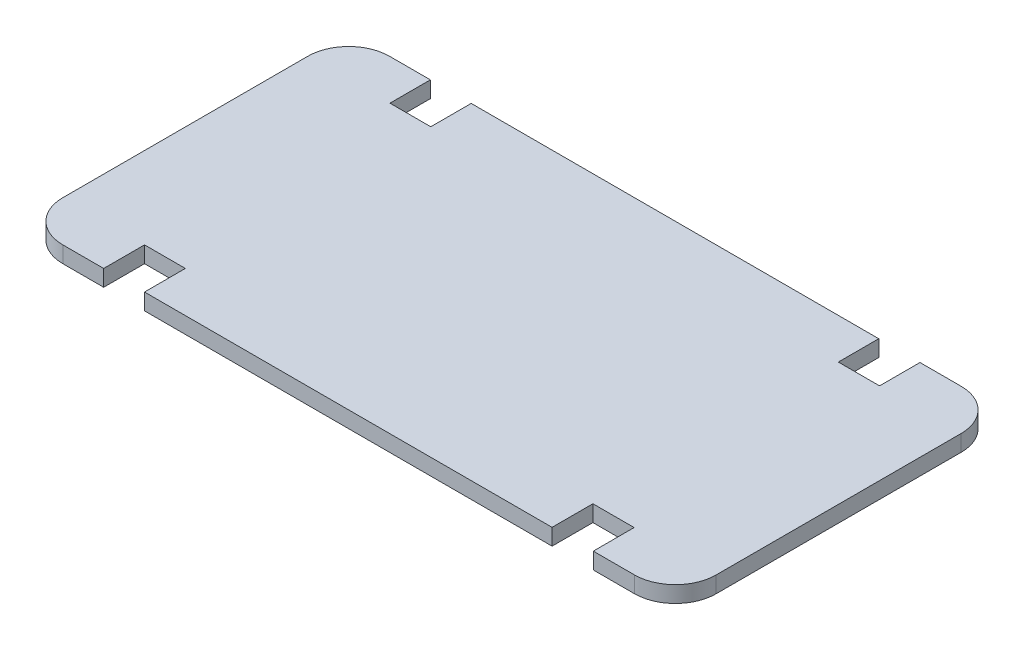
ISO-10303-21;
HEADER;
FILE_DESCRIPTION(('STEP AP214'),'2;1');
FILE_NAME('part.step','',(''),(''),'','','');
FILE_SCHEMA(('AUTOMOTIVE_DESIGN { 1 0 10303 214 1 1 1 1 }'));
ENDSEC;
DATA;
#1=APPLICATION_CONTEXT('core data for automotive mechanical design processes');
#2=APPLICATION_PROTOCOL_DEFINITION('international standard','automotive_design',2000,#1);
#3=PRODUCT_CONTEXT('',#1,'mechanical');
#4=PRODUCT('Part','Part','',(#3));
#5=PRODUCT_RELATED_PRODUCT_CATEGORY('part','',(#4));
#6=PRODUCT_DEFINITION_FORMATION('','',#4);
#7=PRODUCT_DEFINITION_CONTEXT('part definition',#1,'design');
#8=PRODUCT_DEFINITION('design','',#6,#7);
#9=PRODUCT_DEFINITION_SHAPE('','',#8);
#10=(LENGTH_UNIT() NAMED_UNIT(*) SI_UNIT(.MILLI.,.METRE.));
#11=(NAMED_UNIT(*) PLANE_ANGLE_UNIT() SI_UNIT($,.RADIAN.));
#12=(NAMED_UNIT(*) SI_UNIT($,.STERADIAN.) SOLID_ANGLE_UNIT());
#13=UNCERTAINTY_MEASURE_WITH_UNIT(LENGTH_MEASURE(1.E-05),#10,'distance_accuracy_value','');
#14=(GEOMETRIC_REPRESENTATION_CONTEXT(3) GLOBAL_UNCERTAINTY_ASSIGNED_CONTEXT((#13)) GLOBAL_UNIT_ASSIGNED_CONTEXT((#10,
#11,#12)) REPRESENTATION_CONTEXT('',''));
#15=CARTESIAN_POINT('',(0.,0.,0.));
#16=DIRECTION('',(0.,0.,1.));
#17=DIRECTION('',(1.,0.,0.));
#18=AXIS2_PLACEMENT_3D('',#15,#16,#17);
#19=CARTESIAN_POINT('',(-88.8999999999999,5.08,50.8));
#20=DIRECTION('',(0.,0.,-1.));
#21=DIRECTION('',(-1.,0.,0.));
#22=AXIS2_PLACEMENT_3D('',#19,#20,#21);
#23=PLANE('',#22);
#24=DIRECTION('',(1.,0.,0.));
#25=VECTOR('',#24,1.);
#26=CARTESIAN_POINT('',(-88.8999999999999,0.,50.8));
#27=LINE('',#26,#25);
#28=CARTESIAN_POINT('',(-63.4886516228168,0.,50.8));
#29=VERTEX_POINT('',#28);
#30=CARTESIAN_POINT('',(63.2623425436965,0.,50.8));
#31=VERTEX_POINT('',#30);
#32=EDGE_CURVE('E272',#29,#31,#27,.T.);
#33=ORIENTED_EDGE('',*,*,#32,.T.);
#34=DIRECTION('',(0.,1.,0.));
#35=VECTOR('',#34,1.);
#36=CARTESIAN_POINT('',(63.2623425436965,0.,50.8));
#37=LINE('',#36,#35);
#38=CARTESIAN_POINT('',(63.2623425436965,5.08,50.8));
#39=VERTEX_POINT('',#38);
#40=EDGE_CURVE('E331',#31,#39,#37,.T.);
#41=ORIENTED_EDGE('',*,*,#40,.T.);
#42=DIRECTION('',(1.,0.,0.));
#43=VECTOR('',#42,1.);
#44=CARTESIAN_POINT('',(-88.8999999999999,5.08,50.8));
#45=LINE('',#44,#43);
#46=CARTESIAN_POINT('',(-63.4886516228168,5.08,50.8));
#47=VERTEX_POINT('',#46);
#48=EDGE_CURVE('E294',#47,#39,#45,.T.);
#49=ORIENTED_EDGE('',*,*,#48,.F.);
#50=DIRECTION('',(0.,1.,0.));
#51=VECTOR('',#50,1.);
#52=CARTESIAN_POINT('',(-63.4886516228168,0.,50.8));
#53=LINE('',#52,#51);
#54=EDGE_CURVE('E298',#29,#47,#53,.T.);
#55=ORIENTED_EDGE('',*,*,#54,.F.);
#56=EDGE_LOOP('',(#33,#41,#49,#55));
#57=FACE_BOUND('',#56,.T.);
#58=ADVANCED_FACE('F34',(#57),#23,.F.);
#59=CARTESIAN_POINT('',(-88.8999999999999,0.,50.8));
#60=VERTEX_POINT('',#59);
#61=CARTESIAN_POINT('',(-76.1886516228168,0.,50.8));
#62=VERTEX_POINT('',#61);
#63=EDGE_CURVE('E269',#60,#62,#27,.T.);
#64=ORIENTED_EDGE('',*,*,#63,.T.);
#65=DIRECTION('',(0.,1.,0.));
#66=VECTOR('',#65,1.);
#67=CARTESIAN_POINT('',(-76.1886516228168,0.,50.8));
#68=LINE('',#67,#66);
#69=CARTESIAN_POINT('',(-76.1886516228168,5.08,50.8));
#70=VERTEX_POINT('',#69);
#71=EDGE_CURVE('E278',#62,#70,#68,.T.);
#72=ORIENTED_EDGE('',*,*,#71,.T.);
#73=CARTESIAN_POINT('',(-88.8999999999999,5.08,50.8));
#74=VERTEX_POINT('',#73);
#75=EDGE_CURVE('E291',#74,#70,#45,.T.);
#76=ORIENTED_EDGE('',*,*,#75,.F.);
#77=DIRECTION('',(0.,-1.,0.));
#78=VECTOR('',#77,1.);
#79=CARTESIAN_POINT('',(-88.8999999999999,5.08,50.8));
#80=LINE('',#79,#78);
#81=EDGE_CURVE('E11',#74,#60,#80,.T.);
#82=ORIENTED_EDGE('',*,*,#81,.T.);
#83=EDGE_LOOP('',(#64,#72,#76,#82));
#84=FACE_BOUND('',#83,.T.);
#85=ADVANCED_FACE('F413',(#84),#23,.F.);
#86=CARTESIAN_POINT('',(-88.8999999999999,5.08,-50.8));
#87=DIRECTION('',(0.,0.,1.));
#88=DIRECTION('',(1.,0.,0.));
#89=AXIS2_PLACEMENT_3D('',#86,#87,#88);
#90=PLANE('',#89);
#91=DIRECTION('',(-1.,0.,0.));
#92=VECTOR('',#91,1.);
#93=CARTESIAN_POINT('',(-88.8999999999999,5.08,-50.8));
#94=LINE('',#93,#92);
#95=CARTESIAN_POINT('',(-76.1886516228168,5.08,-50.8));
#96=VERTEX_POINT('',#95);
#97=CARTESIAN_POINT('',(-88.8999999999999,5.08,-50.8));
#98=VERTEX_POINT('',#97);
#99=EDGE_CURVE('E285',#96,#98,#94,.T.);
#100=ORIENTED_EDGE('',*,*,#99,.F.);
#101=DIRECTION('',(0.,1.,0.));
#102=VECTOR('',#101,1.);
#103=CARTESIAN_POINT('',(-76.1886516228168,0.,-50.8));
#104=LINE('',#103,#102);
#105=CARTESIAN_POINT('',(-76.1886516228168,0.,-50.8));
#106=VERTEX_POINT('',#105);
#107=EDGE_CURVE('E316',#106,#96,#104,.T.);
#108=ORIENTED_EDGE('',*,*,#107,.F.);
#109=DIRECTION('',(-1.,0.,0.));
#110=VECTOR('',#109,1.);
#111=CARTESIAN_POINT('',(-88.8999999999999,0.,-50.8));
#112=LINE('',#111,#110);
#113=CARTESIAN_POINT('',(-88.8999999999999,0.,-50.8));
#114=VERTEX_POINT('',#113);
#115=EDGE_CURVE('E222',#106,#114,#112,.T.);
#116=ORIENTED_EDGE('',*,*,#115,.T.);
#117=DIRECTION('',(0.,-1.,0.));
#118=VECTOR('',#117,1.);
#119=CARTESIAN_POINT('',(-88.8999999999999,5.08,-50.8));
#120=LINE('',#119,#118);
#121=EDGE_CURVE('E241',#98,#114,#120,.T.);
#122=ORIENTED_EDGE('',*,*,#121,.F.);
#123=EDGE_LOOP('',(#100,#108,#116,#122));
#124=FACE_BOUND('',#123,.T.);
#125=ADVANCED_FACE('F418',(#124),#90,.F.);
#126=CARTESIAN_POINT('',(88.8999999999999,0.,-50.8));
#127=VERTEX_POINT('',#126);
#128=CARTESIAN_POINT('',(76.0844929826214,0.,-50.8));
#129=VERTEX_POINT('',#128);
#130=EDGE_CURVE('E221',#127,#129,#112,.T.);
#131=ORIENTED_EDGE('',*,*,#130,.T.);
#132=DIRECTION('',(0.,1.,0.));
#133=VECTOR('',#132,1.);
#134=CARTESIAN_POINT('',(76.0844929826214,0.,-50.8));
#135=LINE('',#134,#133);
#136=CARTESIAN_POINT('',(76.0844929826214,5.08,-50.8));
#137=VERTEX_POINT('',#136);
#138=EDGE_CURVE('E344',#129,#137,#135,.T.);
#139=ORIENTED_EDGE('',*,*,#138,.T.);
#140=CARTESIAN_POINT('',(88.8999999999999,5.08,-50.8));
#141=VERTEX_POINT('',#140);
#142=EDGE_CURVE('E282',#141,#137,#94,.T.);
#143=ORIENTED_EDGE('',*,*,#142,.F.);
#144=DIRECTION('',(0.,-1.,0.));
#145=VECTOR('',#144,1.);
#146=CARTESIAN_POINT('',(88.8999999999999,5.08,-50.8));
#147=LINE('',#146,#145);
#148=EDGE_CURVE('E244',#141,#127,#147,.T.);
#149=ORIENTED_EDGE('',*,*,#148,.T.);
#150=EDGE_LOOP('',(#131,#139,#143,#149));
#151=FACE_BOUND('',#150,.T.);
#152=ADVANCED_FACE('F391',(#151),#90,.F.);
#153=CARTESIAN_POINT('',(-88.9,5.08,38.1));
#154=DIRECTION('',(0.,-1.,0.));
#155=DIRECTION('',(0.,0.,-1.));
#156=AXIS2_PLACEMENT_3D('',#153,#154,#155);
#157=CYLINDRICAL_SURFACE('',#156,12.7);
#158=CARTESIAN_POINT('',(-88.9,0.,38.1));
#159=DIRECTION('',(0.,1.,0.));
#160=DIRECTION('',(0.,0.,-1.));
#161=AXIS2_PLACEMENT_3D('',#158,#159,#160);
#162=CIRCLE('',#161,12.7);
#163=CARTESIAN_POINT('',(-101.6,0.,38.0999999999999));
#164=VERTEX_POINT('',#163);
#165=EDGE_CURVE('E275',#164,#60,#162,.T.);
#166=ORIENTED_EDGE('',*,*,#165,.T.);
#167=ORIENTED_EDGE('',*,*,#81,.F.);
#168=CARTESIAN_POINT('',(-88.9,5.08,38.1));
#169=DIRECTION('',(0.,1.,0.));
#170=DIRECTION('',(0.,0.,-1.));
#171=AXIS2_PLACEMENT_3D('',#168,#169,#170);
#172=CIRCLE('',#171,12.7);
#173=CARTESIAN_POINT('',(-101.6,5.08,38.0999999999999));
#174=VERTEX_POINT('',#173);
#175=EDGE_CURVE('E233',#174,#74,#172,.T.);
#176=ORIENTED_EDGE('',*,*,#175,.F.);
#177=DIRECTION('',(0.,-1.,0.));
#178=VECTOR('',#177,1.);
#179=CARTESIAN_POINT('',(-101.6,5.08,38.0999999999999));
#180=LINE('',#179,#178);
#181=EDGE_CURVE('E234',#174,#164,#180,.T.);
#182=ORIENTED_EDGE('',*,*,#181,.T.);
#183=EDGE_LOOP('',(#166,#167,#176,#182));
#184=FACE_BOUND('',#183,.T.);
#185=ADVANCED_FACE('F36',(#184),#157,.T.);
#186=CARTESIAN_POINT('',(76.0844929826214,5.08,50.8));
#187=VERTEX_POINT('',#186);
#188=CARTESIAN_POINT('',(88.8999999999999,5.08,50.8));
#189=VERTEX_POINT('',#188);
#190=EDGE_CURVE('E295',#187,#189,#45,.T.);
#191=ORIENTED_EDGE('',*,*,#190,.F.);
#192=DIRECTION('',(0.,1.,0.));
#193=VECTOR('',#192,1.);
#194=CARTESIAN_POINT('',(76.0844929826214,0.,50.8));
#195=LINE('',#194,#193);
#196=CARTESIAN_POINT('',(76.0844929826214,0.,50.8));
#197=VERTEX_POINT('',#196);
#198=EDGE_CURVE('E324',#197,#187,#195,.T.);
#199=ORIENTED_EDGE('',*,*,#198,.F.);
#200=CARTESIAN_POINT('',(88.8999999999999,0.,50.8));
#201=VERTEX_POINT('',#200);
#202=EDGE_CURVE('E266',#197,#201,#27,.T.);
#203=ORIENTED_EDGE('',*,*,#202,.T.);
#204=DIRECTION('',(0.,-1.,0.));
#205=VECTOR('',#204,1.);
#206=CARTESIAN_POINT('',(88.8999999999999,5.08,50.8));
#207=LINE('',#206,#205);
#208=EDGE_CURVE('E42',#189,#201,#207,.T.);
#209=ORIENTED_EDGE('',*,*,#208,.F.);
#210=EDGE_LOOP('',(#191,#199,#203,#209));
#211=FACE_BOUND('',#210,.T.);
#212=ADVANCED_FACE('F410',(#211),#23,.F.);
#213=CARTESIAN_POINT('',(88.9,5.08,38.1));
#214=DIRECTION('',(0.,-1.,0.));
#215=DIRECTION('',(0.,0.,-1.));
#216=AXIS2_PLACEMENT_3D('',#213,#214,#215);
#217=CYLINDRICAL_SURFACE('',#216,12.7);
#218=CARTESIAN_POINT('',(88.9,0.,38.1));
#219=DIRECTION('',(0.,1.,0.));
#220=DIRECTION('',(0.,0.,1.));
#221=AXIS2_PLACEMENT_3D('',#218,#219,#220);
#222=CIRCLE('',#221,12.7);
#223=CARTESIAN_POINT('',(101.6,0.,38.0999999999999));
#224=VERTEX_POINT('',#223);
#225=EDGE_CURVE('E259',#201,#224,#222,.T.);
#226=ORIENTED_EDGE('',*,*,#225,.T.);
#227=DIRECTION('',(0.,-1.,0.));
#228=VECTOR('',#227,1.);
#229=CARTESIAN_POINT('',(101.6,5.08,38.0999999999999));
#230=LINE('',#229,#228);
#231=CARTESIAN_POINT('',(101.6,5.08,38.0999999999999));
#232=VERTEX_POINT('',#231);
#233=EDGE_CURVE('E250',#232,#224,#230,.T.);
#234=ORIENTED_EDGE('',*,*,#233,.F.);
#235=CARTESIAN_POINT('',(88.9,5.08,38.1));
#236=DIRECTION('',(0.,1.,0.));
#237=DIRECTION('',(0.,0.,1.));
#238=AXIS2_PLACEMENT_3D('',#235,#236,#237);
#239=CIRCLE('',#238,12.7);
#240=EDGE_CURVE('E260',#189,#232,#239,.T.);
#241=ORIENTED_EDGE('',*,*,#240,.F.);
#242=ORIENTED_EDGE('',*,*,#208,.T.);
#243=EDGE_LOOP('',(#226,#234,#241,#242));
#244=FACE_BOUND('',#243,.T.);
#245=ADVANCED_FACE('F257',(#244),#217,.T.);
#246=CARTESIAN_POINT('',(101.6,5.08,38.0999999999999));
#247=DIRECTION('',(-1.,0.,0.));
#248=DIRECTION('',(0.,0.,1.));
#249=AXIS2_PLACEMENT_3D('',#246,#247,#248);
#250=PLANE('',#249);
#251=DIRECTION('',(0.,0.,-1.));
#252=VECTOR('',#251,1.);
#253=CARTESIAN_POINT('',(101.6,0.,38.0999999999999));
#254=LINE('',#253,#252);
#255=CARTESIAN_POINT('',(101.6,0.,-38.0999999999999));
#256=VERTEX_POINT('',#255);
#257=EDGE_CURVE('E268',#224,#256,#254,.T.);
#258=ORIENTED_EDGE('',*,*,#257,.T.);
#259=DIRECTION('',(0.,-1.,0.));
#260=VECTOR('',#259,1.);
#261=CARTESIAN_POINT('',(101.6,5.08,-38.0999999999999));
#262=LINE('',#261,#260);
#263=CARTESIAN_POINT('',(101.6,5.08,-38.0999999999999));
#264=VERTEX_POINT('',#263);
#265=EDGE_CURVE('E247',#264,#256,#262,.T.);
#266=ORIENTED_EDGE('',*,*,#265,.F.);
#267=DIRECTION('',(0.,0.,-1.));
#268=VECTOR('',#267,1.);
#269=CARTESIAN_POINT('',(101.6,5.08,38.0999999999999));
#270=LINE('',#269,#268);
#271=EDGE_CURVE('E288',#232,#264,#270,.T.);
#272=ORIENTED_EDGE('',*,*,#271,.F.);
#273=ORIENTED_EDGE('',*,*,#233,.T.);
#274=EDGE_LOOP('',(#258,#266,#272,#273));
#275=FACE_BOUND('',#274,.T.);
#276=ADVANCED_FACE('F402',(#275),#250,.F.);
#277=CARTESIAN_POINT('',(88.9,5.08,-38.1));
#278=DIRECTION('',(0.,-1.,0.));
#279=DIRECTION('',(0.,0.,-1.));
#280=AXIS2_PLACEMENT_3D('',#277,#278,#279);
#281=CYLINDRICAL_SURFACE('',#280,12.7);
#282=CARTESIAN_POINT('',(88.9,0.,-38.1));
#283=DIRECTION('',(0.,1.,0.));
#284=DIRECTION('',(0.,0.,-1.));
#285=AXIS2_PLACEMENT_3D('',#282,#283,#284);
#286=CIRCLE('',#285,12.7);
#287=EDGE_CURVE('E226',#256,#127,#286,.T.);
#288=ORIENTED_EDGE('',*,*,#287,.T.);
#289=ORIENTED_EDGE('',*,*,#148,.F.);
#290=CARTESIAN_POINT('',(88.9,5.08,-38.1));
#291=DIRECTION('',(0.,1.,0.));
#292=DIRECTION('',(0.,0.,-1.));
#293=AXIS2_PLACEMENT_3D('',#290,#291,#292);
#294=CIRCLE('',#293,12.7);
#295=EDGE_CURVE('E286',#264,#141,#294,.T.);
#296=ORIENTED_EDGE('',*,*,#295,.F.);
#297=ORIENTED_EDGE('',*,*,#265,.T.);
#298=EDGE_LOOP('',(#288,#289,#296,#297));
#299=FACE_BOUND('',#298,.T.);
#300=ADVANCED_FACE('F400',(#299),#281,.T.);
#301=CARTESIAN_POINT('',(63.2623425436965,0.,-50.8));
#302=VERTEX_POINT('',#301);
#303=CARTESIAN_POINT('',(-63.4886516228168,0.,-50.8));
#304=VERTEX_POINT('',#303);
#305=EDGE_CURVE('E213',#302,#304,#112,.T.);
#306=ORIENTED_EDGE('',*,*,#305,.T.);
#307=DIRECTION('',(0.,1.,0.));
#308=VECTOR('',#307,1.);
#309=CARTESIAN_POINT('',(-63.4886516228168,0.,-50.8));
#310=LINE('',#309,#308);
#311=CARTESIAN_POINT('',(-63.4886516228168,5.08,-50.8));
#312=VERTEX_POINT('',#311);
#313=EDGE_CURVE('E353',#304,#312,#310,.T.);
#314=ORIENTED_EDGE('',*,*,#313,.T.);
#315=CARTESIAN_POINT('',(63.2623425436965,5.08,-50.8));
#316=VERTEX_POINT('',#315);
#317=EDGE_CURVE('E215',#316,#312,#94,.T.);
#318=ORIENTED_EDGE('',*,*,#317,.F.);
#319=DIRECTION('',(0.,1.,0.));
#320=VECTOR('',#319,1.);
#321=CARTESIAN_POINT('',(63.2623425436965,0.,-50.8));
#322=LINE('',#321,#320);
#323=EDGE_CURVE('E199',#302,#316,#322,.T.);
#324=ORIENTED_EDGE('',*,*,#323,.F.);
#325=EDGE_LOOP('',(#306,#314,#318,#324));
#326=FACE_BOUND('',#325,.T.);
#327=ADVANCED_FACE('F211',(#326),#90,.F.);
#328=CARTESIAN_POINT('',(-88.9,5.08,-38.1));
#329=DIRECTION('',(0.,-1.,0.));
#330=DIRECTION('',(0.,0.,-1.));
#331=AXIS2_PLACEMENT_3D('',#328,#329,#330);
#332=CYLINDRICAL_SURFACE('',#331,12.7);
#333=CARTESIAN_POINT('',(-88.9,0.,-38.1));
#334=DIRECTION('',(0.,1.,0.));
#335=DIRECTION('',(0.,0.,-1.));
#336=AXIS2_PLACEMENT_3D('',#333,#334,#335);
#337=CIRCLE('',#336,12.7);
#338=CARTESIAN_POINT('',(-101.6,0.,-38.0999999999999));
#339=VERTEX_POINT('',#338);
#340=EDGE_CURVE('E225',#114,#339,#337,.T.);
#341=ORIENTED_EDGE('',*,*,#340,.T.);
#342=DIRECTION('',(0.,-1.,0.));
#343=VECTOR('',#342,1.);
#344=CARTESIAN_POINT('',(-101.6,5.08,-38.0999999999999));
#345=LINE('',#344,#343);
#346=CARTESIAN_POINT('',(-101.6,5.08,-38.0999999999999));
#347=VERTEX_POINT('',#346);
#348=EDGE_CURVE('E237',#347,#339,#345,.T.);
#349=ORIENTED_EDGE('',*,*,#348,.F.);
#350=CARTESIAN_POINT('',(-88.9,5.08,-38.1));
#351=DIRECTION('',(0.,1.,0.));
#352=DIRECTION('',(0.,0.,-1.));
#353=AXIS2_PLACEMENT_3D('',#350,#351,#352);
#354=CIRCLE('',#353,12.7);
#355=EDGE_CURVE('E280',#98,#347,#354,.T.);
#356=ORIENTED_EDGE('',*,*,#355,.F.);
#357=ORIENTED_EDGE('',*,*,#121,.T.);
#358=EDGE_LOOP('',(#341,#349,#356,#357));
#359=FACE_BOUND('',#358,.T.);
#360=ADVANCED_FACE('F472',(#359),#332,.T.);
#361=CARTESIAN_POINT('',(-101.6,5.08,38.0999999999999));
#362=DIRECTION('',(1.,0.,0.));
#363=DIRECTION('',(0.,0.,-1.));
#364=AXIS2_PLACEMENT_3D('',#361,#362,#363);
#365=PLANE('',#364);
#366=DIRECTION('',(0.,0.,1.));
#367=VECTOR('',#366,1.);
#368=CARTESIAN_POINT('',(-101.6,0.,38.0999999999999));
#369=LINE('',#368,#367);
#370=EDGE_CURVE('E231',#339,#164,#369,.T.);
#371=ORIENTED_EDGE('',*,*,#370,.T.);
#372=ORIENTED_EDGE('',*,*,#181,.F.);
#373=DIRECTION('',(0.,0.,1.));
#374=VECTOR('',#373,1.);
#375=CARTESIAN_POINT('',(-101.6,5.08,38.0999999999999));
#376=LINE('',#375,#374);
#377=EDGE_CURVE('E238',#347,#174,#376,.T.);
#378=ORIENTED_EDGE('',*,*,#377,.F.);
#379=ORIENTED_EDGE('',*,*,#348,.T.);
#380=EDGE_LOOP('',(#371,#372,#378,#379));
#381=FACE_BOUND('',#380,.T.);
#382=ADVANCED_FACE('F467',(#381),#365,.F.);
#383=CARTESIAN_POINT('',(-88.9,5.08,38.1));
#384=DIRECTION('',(0.,-1.,0.));
#385=DIRECTION('',(0.,0.,-1.));
#386=AXIS2_PLACEMENT_3D('',#383,#384,#385);
#387=PLANE('',#386);
#388=DIRECTION('',(1.,0.,0.));
#389=VECTOR('',#388,1.);
#390=CARTESIAN_POINT('',(-63.4886516228168,5.08,-38.2245880969393));
#391=LINE('',#390,#389);
#392=CARTESIAN_POINT('',(-76.1886516228168,5.08,-38.2245880969393));
#393=VERTEX_POINT('',#392);
#394=CARTESIAN_POINT('',(-63.4886516228168,5.08,-38.2245880969393));
#395=VERTEX_POINT('',#394);
#396=EDGE_CURVE('E359',#393,#395,#391,.T.);
#397=ORIENTED_EDGE('',*,*,#396,.F.);
#398=DIRECTION('',(0.,0.,1.));
#399=VECTOR('',#398,1.);
#400=CARTESIAN_POINT('',(-76.1886516228168,5.08,-38.2245880969393));
#401=LINE('',#400,#399);
#402=EDGE_CURVE('E334',#96,#393,#401,.T.);
#403=ORIENTED_EDGE('',*,*,#402,.F.);
#404=ORIENTED_EDGE('',*,*,#99,.T.);
#405=ORIENTED_EDGE('',*,*,#355,.T.);
#406=ORIENTED_EDGE('',*,*,#377,.T.);
#407=ORIENTED_EDGE('',*,*,#175,.T.);
#408=ORIENTED_EDGE('',*,*,#75,.T.);
#409=DIRECTION('',(0.,0.,1.));
#410=VECTOR('',#409,1.);
#411=CARTESIAN_POINT('',(-76.1886516228168,5.08,50.8));
#412=LINE('',#411,#410);
#413=CARTESIAN_POINT('',(-76.1886516228168,5.08,38.1));
#414=VERTEX_POINT('',#413);
#415=EDGE_CURVE('E307',#414,#70,#412,.T.);
#416=ORIENTED_EDGE('',*,*,#415,.F.);
#417=DIRECTION('',(-1.,0.,0.));
#418=VECTOR('',#417,1.);
#419=CARTESIAN_POINT('',(-76.1886516228168,5.08,38.1));
#420=LINE('',#419,#418);
#421=CARTESIAN_POINT('',(-63.4886516228168,5.08,38.1));
#422=VERTEX_POINT('',#421);
#423=EDGE_CURVE('E310',#422,#414,#420,.T.);
#424=ORIENTED_EDGE('',*,*,#423,.F.);
#425=DIRECTION('',(0.,0.,-1.));
#426=VECTOR('',#425,1.);
#427=CARTESIAN_POINT('',(-63.4886516228168,5.08,38.1));
#428=LINE('',#427,#426);
#429=EDGE_CURVE('E313',#47,#422,#428,.T.);
#430=ORIENTED_EDGE('',*,*,#429,.F.);
#431=ORIENTED_EDGE('',*,*,#48,.T.);
#432=DIRECTION('',(0.,0.,1.));
#433=VECTOR('',#432,1.);
#434=CARTESIAN_POINT('',(63.2623425436965,5.08,38.1));
#435=LINE('',#434,#433);
#436=CARTESIAN_POINT('',(63.2623425436965,5.08,38.1));
#437=VERTEX_POINT('',#436);
#438=EDGE_CURVE('E335',#437,#39,#435,.T.);
#439=ORIENTED_EDGE('',*,*,#438,.F.);
#440=DIRECTION('',(-1.,0.,0.));
#441=VECTOR('',#440,1.);
#442=CARTESIAN_POINT('',(76.0844929826214,5.08,38.1));
#443=LINE('',#442,#441);
#444=CARTESIAN_POINT('',(76.0844929826214,5.08,38.1));
#445=VERTEX_POINT('',#444);
#446=EDGE_CURVE('E338',#445,#437,#443,.T.);
#447=ORIENTED_EDGE('',*,*,#446,.F.);
#448=DIRECTION('',(0.,0.,-1.));
#449=VECTOR('',#448,1.);
#450=CARTESIAN_POINT('',(76.0844929826214,5.08,50.8));
#451=LINE('',#450,#449);
#452=EDGE_CURVE('E341',#187,#445,#451,.T.);
#453=ORIENTED_EDGE('',*,*,#452,.F.);
#454=ORIENTED_EDGE('',*,*,#190,.T.);
#455=ORIENTED_EDGE('',*,*,#240,.T.);
#456=ORIENTED_EDGE('',*,*,#271,.T.);
#457=ORIENTED_EDGE('',*,*,#295,.T.);
#458=ORIENTED_EDGE('',*,*,#142,.T.);
#459=DIRECTION('',(0.,0.,-1.));
#460=VECTOR('',#459,1.);
#461=CARTESIAN_POINT('',(76.0844929826214,5.08,-50.8));
#462=LINE('',#461,#460);
#463=CARTESIAN_POINT('',(76.0844929826214,5.08,-38.2245880969393));
#464=VERTEX_POINT('',#463);
#465=EDGE_CURVE('E206',#464,#137,#462,.T.);
#466=ORIENTED_EDGE('',*,*,#465,.F.);
#467=DIRECTION('',(1.,0.,0.));
#468=VECTOR('',#467,1.);
#469=CARTESIAN_POINT('',(76.0844929826214,5.08,-38.2245880969393));
#470=LINE('',#469,#468);
#471=CARTESIAN_POINT('',(63.2623425436965,5.08,-38.2245880969393));
#472=VERTEX_POINT('',#471);
#473=EDGE_CURVE('E374',#472,#464,#470,.T.);
#474=ORIENTED_EDGE('',*,*,#473,.F.);
#475=DIRECTION('',(0.,0.,1.));
#476=VECTOR('',#475,1.);
#477=CARTESIAN_POINT('',(63.2623425436965,5.08,-38.2245880969393));
#478=LINE('',#477,#476);
#479=EDGE_CURVE('E377',#316,#472,#478,.T.);
#480=ORIENTED_EDGE('',*,*,#479,.F.);
#481=ORIENTED_EDGE('',*,*,#317,.T.);
#482=DIRECTION('',(0.,0.,-1.));
#483=VECTOR('',#482,1.);
#484=CARTESIAN_POINT('',(-63.4886516228168,5.08,-50.8));
#485=LINE('',#484,#483);
#486=EDGE_CURVE('E356',#395,#312,#485,.T.);
#487=ORIENTED_EDGE('',*,*,#486,.F.);
#488=EDGE_LOOP('',(#397,#403,#404,#405,#406,#407,#408,#416,#424,#430,#431,#439,#447,#453,#454,
#455,#456,#457,#458,#466,#474,#480,#481,#487));
#489=FACE_BOUND('',#488,.T.);
#490=ADVANCED_FACE('F394',(#489),#387,.F.);
#491=CARTESIAN_POINT('',(-88.9,0.,38.1));
#492=DIRECTION('',(0.,-1.,0.));
#493=DIRECTION('',(0.,0.,-1.));
#494=AXIS2_PLACEMENT_3D('',#491,#492,#493);
#495=PLANE('',#494);
#496=DIRECTION('',(0.,0.,1.));
#497=VECTOR('',#496,1.);
#498=CARTESIAN_POINT('',(-76.1886516228168,0.,-38.2245880969393));
#499=LINE('',#498,#497);
#500=CARTESIAN_POINT('',(-76.1886516228168,0.,-38.2245880969393));
#501=VERTEX_POINT('',#500);
#502=EDGE_CURVE('E358',#106,#501,#499,.T.);
#503=ORIENTED_EDGE('',*,*,#502,.T.);
#504=DIRECTION('',(1.,0.,0.));
#505=VECTOR('',#504,1.);
#506=CARTESIAN_POINT('',(-63.4886516228168,0.,-38.2245880969393));
#507=LINE('',#506,#505);
#508=CARTESIAN_POINT('',(-63.4886516228168,0.,-38.2245880969393));
#509=VERTEX_POINT('',#508);
#510=EDGE_CURVE('E365',#501,#509,#507,.T.);
#511=ORIENTED_EDGE('',*,*,#510,.T.);
#512=DIRECTION('',(0.,0.,-1.));
#513=VECTOR('',#512,1.);
#514=CARTESIAN_POINT('',(-63.4886516228168,0.,-50.8));
#515=LINE('',#514,#513);
#516=EDGE_CURVE('E49',#509,#304,#515,.T.);
#517=ORIENTED_EDGE('',*,*,#516,.T.);
#518=ORIENTED_EDGE('',*,*,#305,.F.);
#519=DIRECTION('',(0.,0.,1.));
#520=VECTOR('',#519,1.);
#521=CARTESIAN_POINT('',(63.2623425436965,0.,-38.2245880969393));
#522=LINE('',#521,#520);
#523=CARTESIAN_POINT('',(63.2623425436965,0.,-38.2245880969393));
#524=VERTEX_POINT('',#523);
#525=EDGE_CURVE('E195',#302,#524,#522,.T.);
#526=ORIENTED_EDGE('',*,*,#525,.T.);
#527=DIRECTION('',(1.,0.,0.));
#528=VECTOR('',#527,1.);
#529=CARTESIAN_POINT('',(76.0844929826214,0.,-38.2245880969393));
#530=LINE('',#529,#528);
#531=CARTESIAN_POINT('',(76.0844929826214,0.,-38.2245880969393));
#532=VERTEX_POINT('',#531);
#533=EDGE_CURVE('E205',#524,#532,#530,.T.);
#534=ORIENTED_EDGE('',*,*,#533,.T.);
#535=DIRECTION('',(0.,0.,-1.));
#536=VECTOR('',#535,1.);
#537=CARTESIAN_POINT('',(76.0844929826214,0.,-50.8));
#538=LINE('',#537,#536);
#539=EDGE_CURVE('E216',#532,#129,#538,.T.);
#540=ORIENTED_EDGE('',*,*,#539,.T.);
#541=ORIENTED_EDGE('',*,*,#130,.F.);
#542=ORIENTED_EDGE('',*,*,#287,.F.);
#543=ORIENTED_EDGE('',*,*,#257,.F.);
#544=ORIENTED_EDGE('',*,*,#225,.F.);
#545=ORIENTED_EDGE('',*,*,#202,.F.);
#546=DIRECTION('',(0.,0.,-1.));
#547=VECTOR('',#546,1.);
#548=CARTESIAN_POINT('',(76.0844929826214,0.,50.8));
#549=LINE('',#548,#547);
#550=CARTESIAN_POINT('',(76.0844929826214,0.,38.1));
#551=VERTEX_POINT('',#550);
#552=EDGE_CURVE('E337',#197,#551,#549,.T.);
#553=ORIENTED_EDGE('',*,*,#552,.T.);
#554=DIRECTION('',(-1.,0.,0.));
#555=VECTOR('',#554,1.);
#556=CARTESIAN_POINT('',(76.0844929826214,0.,38.1));
#557=LINE('',#556,#555);
#558=CARTESIAN_POINT('',(63.2623425436965,0.,38.1));
#559=VERTEX_POINT('',#558);
#560=EDGE_CURVE('E57',#551,#559,#557,.T.);
#561=ORIENTED_EDGE('',*,*,#560,.T.);
#562=DIRECTION('',(0.,0.,1.));
#563=VECTOR('',#562,1.);
#564=CARTESIAN_POINT('',(63.2623425436965,0.,38.1));
#565=LINE('',#564,#563);
#566=EDGE_CURVE('E327',#559,#31,#565,.T.);
#567=ORIENTED_EDGE('',*,*,#566,.T.);
#568=ORIENTED_EDGE('',*,*,#32,.F.);
#569=DIRECTION('',(0.,0.,-1.));
#570=VECTOR('',#569,1.);
#571=CARTESIAN_POINT('',(-63.4886516228168,0.,38.1));
#572=LINE('',#571,#570);
#573=CARTESIAN_POINT('',(-63.4886516228168,0.,38.1));
#574=VERTEX_POINT('',#573);
#575=EDGE_CURVE('E309',#29,#574,#572,.T.);
#576=ORIENTED_EDGE('',*,*,#575,.T.);
#577=DIRECTION('',(-1.,0.,0.));
#578=VECTOR('',#577,1.);
#579=CARTESIAN_POINT('',(-76.1886516228168,0.,38.1));
#580=LINE('',#579,#578);
#581=CARTESIAN_POINT('',(-76.1886516228168,0.,38.1));
#582=VERTEX_POINT('',#581);
#583=EDGE_CURVE('E319',#574,#582,#580,.T.);
#584=ORIENTED_EDGE('',*,*,#583,.T.);
#585=DIRECTION('',(0.,0.,1.));
#586=VECTOR('',#585,1.);
#587=CARTESIAN_POINT('',(-76.1886516228168,0.,50.8));
#588=LINE('',#587,#586);
#589=EDGE_CURVE('E301',#582,#62,#588,.T.);
#590=ORIENTED_EDGE('',*,*,#589,.T.);
#591=ORIENTED_EDGE('',*,*,#63,.F.);
#592=ORIENTED_EDGE('',*,*,#165,.F.);
#593=ORIENTED_EDGE('',*,*,#370,.F.);
#594=ORIENTED_EDGE('',*,*,#340,.F.);
#595=ORIENTED_EDGE('',*,*,#115,.F.);
#596=EDGE_LOOP('',(#503,#511,#517,#518,#526,#534,#540,#541,#542,#543,#544,#545,#553,#561,#567,
#568,#576,#584,#590,#591,#592,#593,#594,#595));
#597=FACE_BOUND('',#596,.T.);
#598=ADVANCED_FACE('F219',(#597),#495,.T.);
#599=CARTESIAN_POINT('',(-76.1886516228168,0.,50.8));
#600=DIRECTION('',(-1.,0.,0.));
#601=DIRECTION('',(0.,0.,1.));
#602=AXIS2_PLACEMENT_3D('',#599,#600,#601);
#603=PLANE('',#602);
#604=ORIENTED_EDGE('',*,*,#415,.T.);
#605=ORIENTED_EDGE('',*,*,#71,.F.);
#606=ORIENTED_EDGE('',*,*,#589,.F.);
#607=DIRECTION('',(0.,1.,0.));
#608=VECTOR('',#607,1.);
#609=CARTESIAN_POINT('',(-76.1886516228168,0.,38.1));
#610=LINE('',#609,#608);
#611=EDGE_CURVE('E303',#582,#414,#610,.T.);
#612=ORIENTED_EDGE('',*,*,#611,.T.);
#613=EDGE_LOOP('',(#604,#605,#606,#612));
#614=FACE_BOUND('',#613,.T.);
#615=ADVANCED_FACE('F453',(#614),#603,.F.);
#616=CARTESIAN_POINT('',(-76.1886516228168,0.,38.1));
#617=DIRECTION('',(0.,0.,-1.));
#618=DIRECTION('',(-1.,0.,0.));
#619=AXIS2_PLACEMENT_3D('',#616,#617,#618);
#620=PLANE('',#619);
#621=ORIENTED_EDGE('',*,*,#423,.T.);
#622=ORIENTED_EDGE('',*,*,#611,.F.);
#623=ORIENTED_EDGE('',*,*,#583,.F.);
#624=DIRECTION('',(0.,1.,0.));
#625=VECTOR('',#624,1.);
#626=CARTESIAN_POINT('',(-63.4886516228168,0.,38.1));
#627=LINE('',#626,#625);
#628=EDGE_CURVE('E300',#574,#422,#627,.T.);
#629=ORIENTED_EDGE('',*,*,#628,.T.);
#630=EDGE_LOOP('',(#621,#622,#623,#629));
#631=FACE_BOUND('',#630,.T.);
#632=ADVANCED_FACE('F456',(#631),#620,.F.);
#633=CARTESIAN_POINT('',(-63.4886516228168,0.,38.1));
#634=DIRECTION('',(1.,0.,0.));
#635=DIRECTION('',(0.,0.,-1.));
#636=AXIS2_PLACEMENT_3D('',#633,#634,#635);
#637=PLANE('',#636);
#638=ORIENTED_EDGE('',*,*,#429,.T.);
#639=ORIENTED_EDGE('',*,*,#628,.F.);
#640=ORIENTED_EDGE('',*,*,#575,.F.);
#641=ORIENTED_EDGE('',*,*,#54,.T.);
#642=EDGE_LOOP('',(#638,#639,#640,#641));
#643=FACE_BOUND('',#642,.T.);
#644=ADVANCED_FACE('F460',(#643),#637,.F.);
#645=CARTESIAN_POINT('',(76.0844929826214,0.,-50.8));
#646=DIRECTION('',(1.,0.,0.));
#647=DIRECTION('',(0.,0.,-1.));
#648=AXIS2_PLACEMENT_3D('',#645,#646,#647);
#649=PLANE('',#648);
#650=ORIENTED_EDGE('',*,*,#465,.T.);
#651=ORIENTED_EDGE('',*,*,#138,.F.);
#652=ORIENTED_EDGE('',*,*,#539,.F.);
#653=DIRECTION('',(0.,1.,0.));
#654=VECTOR('',#653,1.);
#655=CARTESIAN_POINT('',(76.0844929826214,0.,-38.2245880969393));
#656=LINE('',#655,#654);
#657=EDGE_CURVE('E369',#532,#464,#656,.T.);
#658=ORIENTED_EDGE('',*,*,#657,.T.);
#659=EDGE_LOOP('',(#650,#651,#652,#658));
#660=FACE_BOUND('',#659,.T.);
#661=ADVANCED_FACE('F388',(#660),#649,.F.);
#662=CARTESIAN_POINT('',(76.0844929826214,0.,-38.2245880969393));
#663=DIRECTION('',(0.,0.,1.));
#664=DIRECTION('',(1.,0.,0.));
#665=AXIS2_PLACEMENT_3D('',#662,#663,#664);
#666=PLANE('',#665);
#667=ORIENTED_EDGE('',*,*,#473,.T.);
#668=ORIENTED_EDGE('',*,*,#657,.F.);
#669=ORIENTED_EDGE('',*,*,#533,.F.);
#670=DIRECTION('',(0.,1.,0.));
#671=VECTOR('',#670,1.);
#672=CARTESIAN_POINT('',(63.2623425436965,0.,-38.2245880969393));
#673=LINE('',#672,#671);
#674=EDGE_CURVE('E201',#524,#472,#673,.T.);
#675=ORIENTED_EDGE('',*,*,#674,.T.);
#676=EDGE_LOOP('',(#667,#668,#669,#675));
#677=FACE_BOUND('',#676,.T.);
#678=ADVANCED_FACE('F384',(#677),#666,.F.);
#679=CARTESIAN_POINT('',(63.2623425436965,0.,-38.2245880969393));
#680=DIRECTION('',(-1.,0.,0.));
#681=DIRECTION('',(0.,0.,1.));
#682=AXIS2_PLACEMENT_3D('',#679,#680,#681);
#683=PLANE('',#682);
#684=ORIENTED_EDGE('',*,*,#479,.T.);
#685=ORIENTED_EDGE('',*,*,#674,.F.);
#686=ORIENTED_EDGE('',*,*,#525,.F.);
#687=ORIENTED_EDGE('',*,*,#323,.T.);
#688=EDGE_LOOP('',(#684,#685,#686,#687));
#689=FACE_BOUND('',#688,.T.);
#690=ADVANCED_FACE('F198',(#689),#683,.F.);
#691=CARTESIAN_POINT('',(63.2623425436965,0.,38.1));
#692=DIRECTION('',(-1.,0.,0.));
#693=DIRECTION('',(0.,0.,1.));
#694=AXIS2_PLACEMENT_3D('',#691,#692,#693);
#695=PLANE('',#694);
#696=ORIENTED_EDGE('',*,*,#438,.T.);
#697=ORIENTED_EDGE('',*,*,#40,.F.);
#698=ORIENTED_EDGE('',*,*,#566,.F.);
#699=DIRECTION('',(0.,1.,0.));
#700=VECTOR('',#699,1.);
#701=CARTESIAN_POINT('',(63.2623425436965,0.,38.1));
#702=LINE('',#701,#700);
#703=EDGE_CURVE('E329',#559,#437,#702,.T.);
#704=ORIENTED_EDGE('',*,*,#703,.T.);
#705=EDGE_LOOP('',(#696,#697,#698,#704));
#706=FACE_BOUND('',#705,.T.);
#707=ADVANCED_FACE('F438',(#706),#695,.F.);
#708=CARTESIAN_POINT('',(76.0844929826214,0.,38.1));
#709=DIRECTION('',(0.,0.,-1.));
#710=DIRECTION('',(-1.,0.,0.));
#711=AXIS2_PLACEMENT_3D('',#708,#709,#710);
#712=PLANE('',#711);
#713=ORIENTED_EDGE('',*,*,#446,.T.);
#714=ORIENTED_EDGE('',*,*,#703,.F.);
#715=ORIENTED_EDGE('',*,*,#560,.F.);
#716=DIRECTION('',(0.,1.,0.));
#717=VECTOR('',#716,1.);
#718=CARTESIAN_POINT('',(76.0844929826214,0.,38.1));
#719=LINE('',#718,#717);
#720=EDGE_CURVE('E326',#551,#445,#719,.T.);
#721=ORIENTED_EDGE('',*,*,#720,.T.);
#722=EDGE_LOOP('',(#713,#714,#715,#721));
#723=FACE_BOUND('',#722,.T.);
#724=ADVANCED_FACE('F441',(#723),#712,.F.);
#725=CARTESIAN_POINT('',(76.0844929826214,0.,50.8));
#726=DIRECTION('',(1.,0.,0.));
#727=DIRECTION('',(0.,0.,-1.));
#728=AXIS2_PLACEMENT_3D('',#725,#726,#727);
#729=PLANE('',#728);
#730=ORIENTED_EDGE('',*,*,#452,.T.);
#731=ORIENTED_EDGE('',*,*,#720,.F.);
#732=ORIENTED_EDGE('',*,*,#552,.F.);
#733=ORIENTED_EDGE('',*,*,#198,.T.);
#734=EDGE_LOOP('',(#730,#731,#732,#733));
#735=FACE_BOUND('',#734,.T.);
#736=ADVANCED_FACE('F440',(#735),#729,.F.);
#737=CARTESIAN_POINT('',(-76.1886516228168,0.,-38.2245880969393));
#738=DIRECTION('',(-1.,0.,0.));
#739=DIRECTION('',(0.,0.,1.));
#740=AXIS2_PLACEMENT_3D('',#737,#738,#739);
#741=PLANE('',#740);
#742=ORIENTED_EDGE('',*,*,#402,.T.);
#743=DIRECTION('',(0.,1.,0.));
#744=VECTOR('',#743,1.);
#745=CARTESIAN_POINT('',(-76.1886516228168,0.,-38.2245880969393));
#746=LINE('',#745,#744);
#747=EDGE_CURVE('E349',#501,#393,#746,.T.);
#748=ORIENTED_EDGE('',*,*,#747,.F.);
#749=ORIENTED_EDGE('',*,*,#502,.F.);
#750=ORIENTED_EDGE('',*,*,#107,.T.);
#751=EDGE_LOOP('',(#742,#748,#749,#750));
#752=FACE_BOUND('',#751,.T.);
#753=ADVANCED_FACE('F448',(#752),#741,.F.);
#754=CARTESIAN_POINT('',(-63.4886516228168,0.,-50.8));
#755=DIRECTION('',(1.,0.,0.));
#756=DIRECTION('',(0.,0.,-1.));
#757=AXIS2_PLACEMENT_3D('',#754,#755,#756);
#758=PLANE('',#757);
#759=ORIENTED_EDGE('',*,*,#486,.T.);
#760=ORIENTED_EDGE('',*,*,#313,.F.);
#761=ORIENTED_EDGE('',*,*,#516,.F.);
#762=DIRECTION('',(0.,1.,0.));
#763=VECTOR('',#762,1.);
#764=CARTESIAN_POINT('',(-63.4886516228168,0.,-38.2245880969393));
#765=LINE('',#764,#763);
#766=EDGE_CURVE('E351',#509,#395,#765,.T.);
#767=ORIENTED_EDGE('',*,*,#766,.T.);
#768=EDGE_LOOP('',(#759,#760,#761,#767));
#769=FACE_BOUND('',#768,.T.);
#770=ADVANCED_FACE('F625',(#769),#758,.F.);
#771=CARTESIAN_POINT('',(-63.4886516228168,0.,-38.2245880969393));
#772=DIRECTION('',(0.,0.,1.));
#773=DIRECTION('',(1.,0.,0.));
#774=AXIS2_PLACEMENT_3D('',#771,#772,#773);
#775=PLANE('',#774);
#776=ORIENTED_EDGE('',*,*,#396,.T.);
#777=ORIENTED_EDGE('',*,*,#766,.F.);
#778=ORIENTED_EDGE('',*,*,#510,.F.);
#779=ORIENTED_EDGE('',*,*,#747,.T.);
#780=EDGE_LOOP('',(#776,#777,#778,#779));
#781=FACE_BOUND('',#780,.T.);
#782=ADVANCED_FACE('F633',(#781),#775,.F.);
#783=CLOSED_SHELL('',(#58,#85,#125,#152,#185,#212,#245,#276,#300,#327,#360,#382,#490,#598,#615,
#632,#644,#661,#678,#690,#707,#724,#736,#753,#770,#782));
#784=MANIFOLD_SOLID_BREP('B2',#783);
#785=ADVANCED_BREP_SHAPE_REPRESENTATION('',(#18,#784),#14);
#786=SHAPE_DEFINITION_REPRESENTATION(#9,#785);
ENDSEC;
END-ISO-10303-21;
